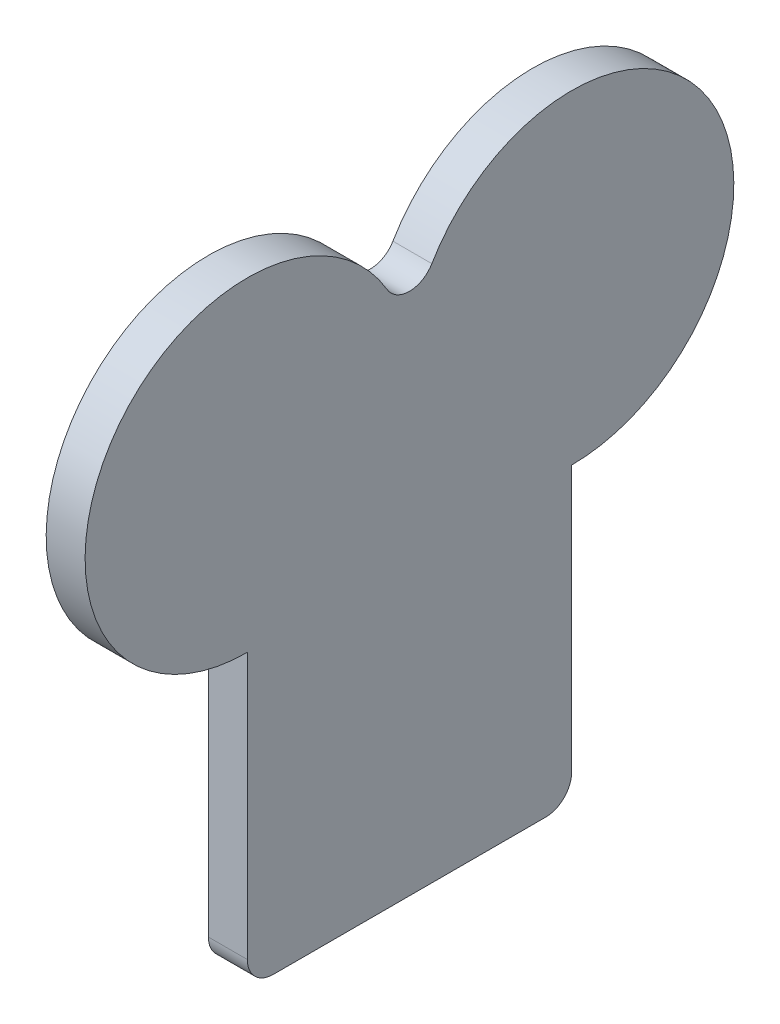
ISO-10303-21;
HEADER;
FILE_DESCRIPTION(('STEP AP214'),'2;1');
FILE_NAME('part.step','',(''),(''),'','','');
FILE_SCHEMA(('AUTOMOTIVE_DESIGN { 1 0 10303 214 1 1 1 1 }'));
ENDSEC;
DATA;
#1=APPLICATION_CONTEXT('core data for automotive mechanical design processes');
#2=APPLICATION_PROTOCOL_DEFINITION('international standard','automotive_design',2000,#1);
#3=PRODUCT_CONTEXT('',#1,'mechanical');
#4=PRODUCT('Part','Part','',(#3));
#5=PRODUCT_RELATED_PRODUCT_CATEGORY('part','',(#4));
#6=PRODUCT_DEFINITION_FORMATION('','',#4);
#7=PRODUCT_DEFINITION_CONTEXT('part definition',#1,'design');
#8=PRODUCT_DEFINITION('design','',#6,#7);
#9=PRODUCT_DEFINITION_SHAPE('','',#8);
#10=(LENGTH_UNIT() NAMED_UNIT(*) SI_UNIT(.MILLI.,.METRE.));
#11=(NAMED_UNIT(*) PLANE_ANGLE_UNIT() SI_UNIT($,.RADIAN.));
#12=(NAMED_UNIT(*) SI_UNIT($,.STERADIAN.) SOLID_ANGLE_UNIT());
#13=UNCERTAINTY_MEASURE_WITH_UNIT(LENGTH_MEASURE(1.E-05),#10,'distance_accuracy_value','');
#14=(GEOMETRIC_REPRESENTATION_CONTEXT(3) GLOBAL_UNCERTAINTY_ASSIGNED_CONTEXT((#13)) GLOBAL_UNIT_ASSIGNED_CONTEXT((#10,
#11,#12)) REPRESENTATION_CONTEXT('',''));
#15=CARTESIAN_POINT('',(0.,0.,0.));
#16=DIRECTION('',(0.,0.,1.));
#17=DIRECTION('',(1.,0.,0.));
#18=AXIS2_PLACEMENT_3D('',#15,#16,#17);
#19=CARTESIAN_POINT('',(15.,87.5000000000001,62.5));
#20=DIRECTION('',(-1.,0.,0.));
#21=DIRECTION('',(0.,0.,1.));
#22=AXIS2_PLACEMENT_3D('',#19,#20,#21);
#23=CYLINDRICAL_SURFACE('',#22,62.5);
#24=CARTESIAN_POINT('',(15.,87.5000000000001,62.5));
#25=DIRECTION('',(1.,0.,0.));
#26=DIRECTION('',(0.,0.,-1.));
#27=AXIS2_PLACEMENT_3D('',#24,#25,#26);
#28=CIRCLE('',#27,62.5);
#29=CARTESIAN_POINT('',(15.,119.174436329093,8.62068965517241));
#30=VERTEX_POINT('',#29);
#31=CARTESIAN_POINT('',(15.,25.0000000000001,62.5));
#32=VERTEX_POINT('',#31);
#33=EDGE_CURVE('E99',#30,#32,#28,.T.);
#34=ORIENTED_EDGE('',*,*,#33,.F.);
#35=DIRECTION('',(-1.,0.,0.));
#36=VECTOR('',#35,1.);
#37=CARTESIAN_POINT('',(15.,119.174436329093,8.62068965517242));
#38=LINE('',#37,#36);
#39=CARTESIAN_POINT('',(0.,119.174436329093,8.62068965517241));
#40=VERTEX_POINT('',#39);
#41=EDGE_CURVE('E120',#30,#40,#38,.T.);
#42=ORIENTED_EDGE('',*,*,#41,.T.);
#43=CARTESIAN_POINT('',(0.,87.5000000000001,62.5));
#44=DIRECTION('',(1.,0.,0.));
#45=DIRECTION('',(0.,0.,-1.));
#46=AXIS2_PLACEMENT_3D('',#43,#44,#45);
#47=CIRCLE('',#46,62.5);
#48=CARTESIAN_POINT('',(0.,25.0000000000001,62.5));
#49=VERTEX_POINT('',#48);
#50=EDGE_CURVE('E118',#40,#49,#47,.T.);
#51=ORIENTED_EDGE('',*,*,#50,.T.);
#52=DIRECTION('',(-1.,0.,0.));
#53=VECTOR('',#52,1.);
#54=CARTESIAN_POINT('',(15.,25.0000000000001,62.5));
#55=LINE('',#54,#53);
#56=EDGE_CURVE('E114',#32,#49,#55,.T.);
#57=ORIENTED_EDGE('',*,*,#56,.F.);
#58=EDGE_LOOP('',(#34,#42,#51,#57));
#59=FACE_BOUND('',#58,.T.);
#60=ADVANCED_FACE('F33',(#59),#23,.T.);
#61=CARTESIAN_POINT('',(15.,25.0000000000001,62.5));
#62=DIRECTION('',(0.,0.,-1.));
#63=DIRECTION('',(0.,1.,0.));
#64=AXIS2_PLACEMENT_3D('',#61,#62,#63);
#65=PLANE('',#64);
#66=DIRECTION('',(0.,-1.,0.));
#67=VECTOR('',#66,1.);
#68=CARTESIAN_POINT('',(0.,25.0000000000001,62.5));
#69=LINE('',#68,#67);
#70=CARTESIAN_POINT('',(0.,-77.4999999999999,62.5));
#71=VERTEX_POINT('',#70);
#72=EDGE_CURVE('E166',#49,#71,#69,.T.);
#73=ORIENTED_EDGE('',*,*,#72,.T.);
#74=DIRECTION('',(-1.,0.,0.));
#75=VECTOR('',#74,1.);
#76=CARTESIAN_POINT('',(15.,-77.4999999999999,62.5));
#77=LINE('',#76,#75);
#78=CARTESIAN_POINT('',(15.,-77.4999999999999,62.5));
#79=VERTEX_POINT('',#78);
#80=EDGE_CURVE('E11',#71,#79,#77,.F.);
#81=ORIENTED_EDGE('',*,*,#80,.T.);
#82=DIRECTION('',(0.,-1.,0.));
#83=VECTOR('',#82,1.);
#84=CARTESIAN_POINT('',(15.,25.0000000000001,62.5));
#85=LINE('',#84,#83);
#86=EDGE_CURVE('E101',#32,#79,#85,.T.);
#87=ORIENTED_EDGE('',*,*,#86,.F.);
#88=ORIENTED_EDGE('',*,*,#56,.T.);
#89=EDGE_LOOP('',(#73,#81,#87,#88));
#90=FACE_BOUND('',#89,.T.);
#91=ADVANCED_FACE('F113',(#90),#65,.F.);
#92=CARTESIAN_POINT('',(15.,-87.4999999999999,62.5));
#93=DIRECTION('',(0.,1.,0.));
#94=DIRECTION('',(0.,0.,1.));
#95=AXIS2_PLACEMENT_3D('',#92,#93,#94);
#96=PLANE('',#95);
#97=DIRECTION('',(0.,0.,-1.));
#98=VECTOR('',#97,1.);
#99=CARTESIAN_POINT('',(0.,-87.4999999999999,62.5));
#100=LINE('',#99,#98);
#101=CARTESIAN_POINT('',(0.,-87.4999999999999,52.5));
#102=VERTEX_POINT('',#101);
#103=CARTESIAN_POINT('',(0.,-87.5,-52.5));
#104=VERTEX_POINT('',#103);
#105=EDGE_CURVE('E161',#102,#104,#100,.T.);
#106=ORIENTED_EDGE('',*,*,#105,.T.);
#107=DIRECTION('',(-1.,0.,0.));
#108=VECTOR('',#107,1.);
#109=CARTESIAN_POINT('',(15.,-87.5,-52.5));
#110=LINE('',#109,#108);
#111=CARTESIAN_POINT('',(15.,-87.5,-52.5));
#112=VERTEX_POINT('',#111);
#113=EDGE_CURVE('E54',#104,#112,#110,.F.);
#114=ORIENTED_EDGE('',*,*,#113,.T.);
#115=DIRECTION('',(0.,0.,-1.));
#116=VECTOR('',#115,1.);
#117=CARTESIAN_POINT('',(15.,-87.4999999999999,62.5));
#118=LINE('',#117,#116);
#119=CARTESIAN_POINT('',(15.,-87.4999999999999,52.5));
#120=VERTEX_POINT('',#119);
#121=EDGE_CURVE('E115',#120,#112,#118,.T.);
#122=ORIENTED_EDGE('',*,*,#121,.F.);
#123=DIRECTION('',(-1.,0.,0.));
#124=VECTOR('',#123,1.);
#125=CARTESIAN_POINT('',(15.,-87.4999999999999,52.5));
#126=LINE('',#125,#124);
#127=EDGE_CURVE('E140',#120,#102,#126,.T.);
#128=ORIENTED_EDGE('',*,*,#127,.T.);
#129=EDGE_LOOP('',(#106,#114,#122,#128));
#130=FACE_BOUND('',#129,.T.);
#131=ADVANCED_FACE('F164',(#130),#96,.F.);
#132=CARTESIAN_POINT('',(15.,25.0000000000001,-62.5));
#133=DIRECTION('',(0.,0.,-1.));
#134=DIRECTION('',(0.,1.,0.));
#135=AXIS2_PLACEMENT_3D('',#132,#133,#134);
#136=PLANE('',#135);
#137=DIRECTION('',(0.,-1.,0.));
#138=VECTOR('',#137,1.);
#139=CARTESIAN_POINT('',(15.,25.0000000000001,-62.5));
#140=LINE('',#139,#138);
#141=CARTESIAN_POINT('',(15.,25.0000000000001,-62.5));
#142=VERTEX_POINT('',#141);
#143=CARTESIAN_POINT('',(15.,-77.5,-62.5));
#144=VERTEX_POINT('',#143);
#145=EDGE_CURVE('E148',#142,#144,#140,.T.);
#146=ORIENTED_EDGE('',*,*,#145,.T.);
#147=DIRECTION('',(-1.,0.,0.));
#148=VECTOR('',#147,1.);
#149=CARTESIAN_POINT('',(0.,-77.5,-62.5));
#150=LINE('',#149,#148);
#151=CARTESIAN_POINT('',(0.,-77.5,-62.5));
#152=VERTEX_POINT('',#151);
#153=EDGE_CURVE('E133',#144,#152,#150,.T.);
#154=ORIENTED_EDGE('',*,*,#153,.T.);
#155=DIRECTION('',(0.,-1.,0.));
#156=VECTOR('',#155,1.);
#157=CARTESIAN_POINT('',(0.,25.0000000000001,-62.5));
#158=LINE('',#157,#156);
#159=CARTESIAN_POINT('',(0.,25.0000000000001,-62.5));
#160=VERTEX_POINT('',#159);
#161=EDGE_CURVE('E163',#160,#152,#158,.T.);
#162=ORIENTED_EDGE('',*,*,#161,.F.);
#163=DIRECTION('',(-1.,0.,0.));
#164=VECTOR('',#163,1.);
#165=CARTESIAN_POINT('',(15.,25.0000000000001,-62.5));
#166=LINE('',#165,#164);
#167=EDGE_CURVE('E121',#142,#160,#166,.T.);
#168=ORIENTED_EDGE('',*,*,#167,.F.);
#169=EDGE_LOOP('',(#146,#154,#162,#168));
#170=FACE_BOUND('',#169,.T.);
#171=ADVANCED_FACE('F152',(#170),#136,.T.);
#172=CARTESIAN_POINT('',(15.,87.5000000000001,-62.5));
#173=DIRECTION('',(-1.,0.,0.));
#174=DIRECTION('',(0.,0.,1.));
#175=AXIS2_PLACEMENT_3D('',#172,#173,#174);
#176=CYLINDRICAL_SURFACE('',#175,62.5);
#177=CARTESIAN_POINT('',(0.,87.5000000000001,-62.5));
#178=DIRECTION('',(1.,0.,0.));
#179=DIRECTION('',(0.,0.,-1.));
#180=AXIS2_PLACEMENT_3D('',#177,#178,#179);
#181=CIRCLE('',#180,62.5);
#182=CARTESIAN_POINT('',(0.,119.174436329093,-8.62068965517241));
#183=VERTEX_POINT('',#182);
#184=EDGE_CURVE('E110',#160,#183,#181,.T.);
#185=ORIENTED_EDGE('',*,*,#184,.T.);
#186=DIRECTION('',(-1.,0.,0.));
#187=VECTOR('',#186,1.);
#188=CARTESIAN_POINT('',(15.,119.174436329093,-8.62068965517242));
#189=LINE('',#188,#187);
#190=CARTESIAN_POINT('',(15.,119.174436329093,-8.62068965517241));
#191=VERTEX_POINT('',#190);
#192=EDGE_CURVE('E123',#183,#191,#189,.F.);
#193=ORIENTED_EDGE('',*,*,#192,.T.);
#194=CARTESIAN_POINT('',(15.,87.5000000000001,-62.5));
#195=DIRECTION('',(1.,0.,0.));
#196=DIRECTION('',(0.,0.,-1.));
#197=AXIS2_PLACEMENT_3D('',#194,#195,#196);
#198=CIRCLE('',#197,62.5);
#199=EDGE_CURVE('E125',#142,#191,#198,.T.);
#200=ORIENTED_EDGE('',*,*,#199,.F.);
#201=ORIENTED_EDGE('',*,*,#167,.T.);
#202=EDGE_LOOP('',(#185,#193,#200,#201));
#203=FACE_BOUND('',#202,.T.);
#204=ADVANCED_FACE('F174',(#203),#176,.T.);
#205=CARTESIAN_POINT('',(15.,87.5000000000001,62.5));
#206=DIRECTION('',(1.,0.,0.));
#207=DIRECTION('',(0.,0.,-1.));
#208=AXIS2_PLACEMENT_3D('',#205,#206,#207);
#209=PLANE('',#208);
#210=ORIENTED_EDGE('',*,*,#121,.T.);
#211=CARTESIAN_POINT('',(15.,-77.5,-52.5));
#212=DIRECTION('',(1.,0.,0.));
#213=DIRECTION('',(0.,0.,-1.));
#214=AXIS2_PLACEMENT_3D('',#211,#212,#213);
#215=CIRCLE('',#214,10.);
#216=EDGE_CURVE('E41',#112,#144,#215,.T.);
#217=ORIENTED_EDGE('',*,*,#216,.T.);
#218=ORIENTED_EDGE('',*,*,#145,.F.);
#219=ORIENTED_EDGE('',*,*,#199,.T.);
#220=CARTESIAN_POINT('',(15.,124.242346141748,0.));
#221=DIRECTION('',(1.,0.,0.));
#222=DIRECTION('',(0.,0.,-1.));
#223=AXIS2_PLACEMENT_3D('',#220,#221,#222);
#224=CIRCLE('',#223,10.);
#225=EDGE_CURVE('E105',#191,#30,#224,.F.);
#226=ORIENTED_EDGE('',*,*,#225,.T.);
#227=ORIENTED_EDGE('',*,*,#33,.T.);
#228=ORIENTED_EDGE('',*,*,#86,.T.);
#229=CARTESIAN_POINT('',(15.,-77.4999999999999,52.5));
#230=DIRECTION('',(1.,0.,0.));
#231=DIRECTION('',(0.,0.,-1.));
#232=AXIS2_PLACEMENT_3D('',#229,#230,#231);
#233=CIRCLE('',#232,10.);
#234=EDGE_CURVE('E144',#79,#120,#233,.T.);
#235=ORIENTED_EDGE('',*,*,#234,.T.);
#236=EDGE_LOOP('',(#210,#217,#218,#219,#226,#227,#228,#235));
#237=FACE_BOUND('',#236,.T.);
#238=ADVANCED_FACE('F100',(#237),#209,.T.);
#239=CARTESIAN_POINT('',(0.,87.5000000000001,62.5));
#240=DIRECTION('',(1.,0.,0.));
#241=DIRECTION('',(0.,0.,-1.));
#242=AXIS2_PLACEMENT_3D('',#239,#240,#241);
#243=PLANE('',#242);
#244=ORIENTED_EDGE('',*,*,#161,.T.);
#245=CARTESIAN_POINT('',(0.,-77.5,-52.5));
#246=DIRECTION('',(1.,0.,0.));
#247=DIRECTION('',(0.,0.,-1.));
#248=AXIS2_PLACEMENT_3D('',#245,#246,#247);
#249=CIRCLE('',#248,10.);
#250=EDGE_CURVE('E138',#152,#104,#249,.F.);
#251=ORIENTED_EDGE('',*,*,#250,.T.);
#252=ORIENTED_EDGE('',*,*,#105,.F.);
#253=CARTESIAN_POINT('',(0.,-77.4999999999999,52.5));
#254=DIRECTION('',(1.,0.,0.));
#255=DIRECTION('',(0.,0.,-1.));
#256=AXIS2_PLACEMENT_3D('',#253,#254,#255);
#257=CIRCLE('',#256,10.);
#258=EDGE_CURVE('E136',#102,#71,#257,.F.);
#259=ORIENTED_EDGE('',*,*,#258,.T.);
#260=ORIENTED_EDGE('',*,*,#72,.F.);
#261=ORIENTED_EDGE('',*,*,#50,.F.);
#262=CARTESIAN_POINT('',(0.,124.242346141748,0.));
#263=DIRECTION('',(1.,0.,0.));
#264=DIRECTION('',(0.,0.,-1.));
#265=AXIS2_PLACEMENT_3D('',#262,#263,#264);
#266=CIRCLE('',#265,10.);
#267=EDGE_CURVE('E130',#40,#183,#266,.T.);
#268=ORIENTED_EDGE('',*,*,#267,.T.);
#269=ORIENTED_EDGE('',*,*,#184,.F.);
#270=EDGE_LOOP('',(#244,#251,#252,#259,#260,#261,#268,#269));
#271=FACE_BOUND('',#270,.T.);
#272=ADVANCED_FACE('F160',(#271),#243,.F.);
#273=CARTESIAN_POINT('',(15.,124.242346141748,0.));
#274=DIRECTION('',(1.,0.,0.));
#275=DIRECTION('',(0.,0.,-1.));
#276=AXIS2_PLACEMENT_3D('',#273,#274,#275);
#277=CYLINDRICAL_SURFACE('',#276,10.);
#278=ORIENTED_EDGE('',*,*,#225,.F.);
#279=ORIENTED_EDGE('',*,*,#192,.F.);
#280=ORIENTED_EDGE('',*,*,#267,.F.);
#281=ORIENTED_EDGE('',*,*,#41,.F.);
#282=EDGE_LOOP('',(#278,#279,#280,#281));
#283=FACE_BOUND('',#282,.T.);
#284=ADVANCED_FACE('F176',(#283),#277,.F.);
#285=CARTESIAN_POINT('',(15.,-77.5,-52.5));
#286=DIRECTION('',(1.,0.,0.));
#287=DIRECTION('',(0.,0.,-1.));
#288=AXIS2_PLACEMENT_3D('',#285,#286,#287);
#289=CYLINDRICAL_SURFACE('',#288,10.);
#290=ORIENTED_EDGE('',*,*,#216,.F.);
#291=ORIENTED_EDGE('',*,*,#113,.F.);
#292=ORIENTED_EDGE('',*,*,#250,.F.);
#293=ORIENTED_EDGE('',*,*,#153,.F.);
#294=EDGE_LOOP('',(#290,#291,#292,#293));
#295=FACE_BOUND('',#294,.T.);
#296=ADVANCED_FACE('F157',(#295),#289,.T.);
#297=CARTESIAN_POINT('',(15.,-77.4999999999999,52.5));
#298=DIRECTION('',(-1.,0.,0.));
#299=DIRECTION('',(0.,0.,1.));
#300=AXIS2_PLACEMENT_3D('',#297,#298,#299);
#301=CYLINDRICAL_SURFACE('',#300,10.);
#302=ORIENTED_EDGE('',*,*,#234,.F.);
#303=ORIENTED_EDGE('',*,*,#80,.F.);
#304=ORIENTED_EDGE('',*,*,#258,.F.);
#305=ORIENTED_EDGE('',*,*,#127,.F.);
#306=EDGE_LOOP('',(#302,#303,#304,#305));
#307=FACE_BOUND('',#306,.T.);
#308=ADVANCED_FACE('F35',(#307),#301,.T.);
#309=CLOSED_SHELL('',(#60,#91,#131,#171,#204,#238,#272,#284,#296,#308));
#310=MANIFOLD_SOLID_BREP('B2',#309);
#311=ADVANCED_BREP_SHAPE_REPRESENTATION('',(#18,#310),#14);
#312=SHAPE_DEFINITION_REPRESENTATION(#9,#311);
ENDSEC;
END-ISO-10303-21;
